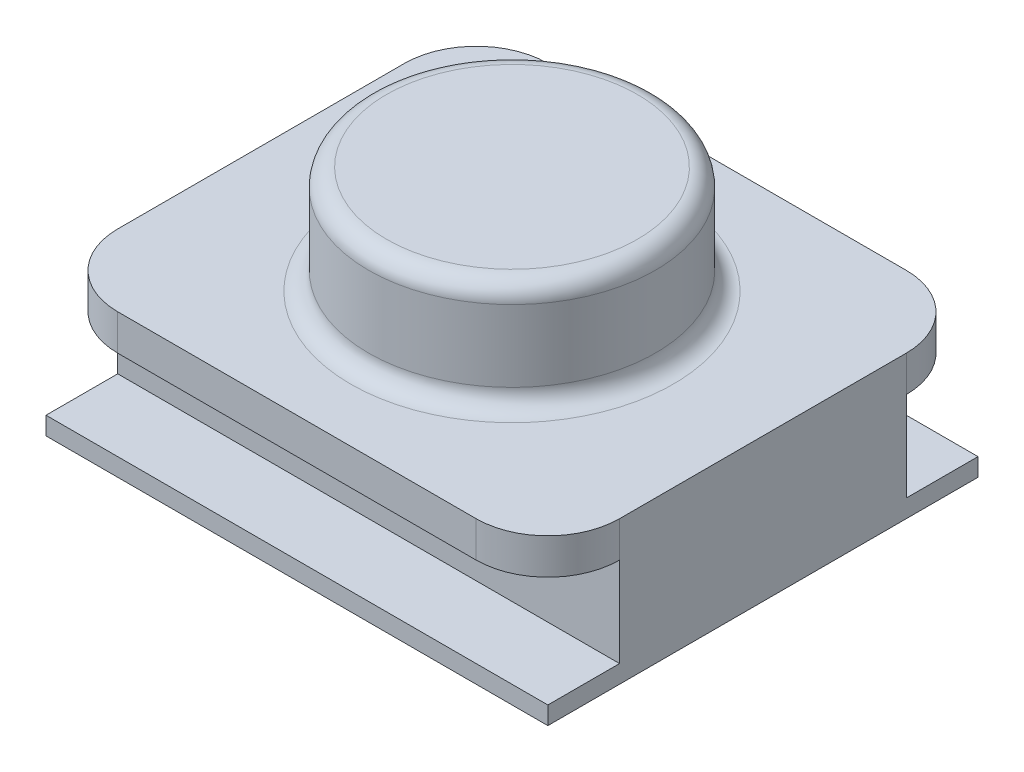
ISO-10303-21;
HEADER;
FILE_DESCRIPTION(('STEP AP214'),'2;1');
FILE_NAME('part.step','',(''),(''),'','','');
FILE_SCHEMA(('AUTOMOTIVE_DESIGN { 1 0 10303 214 1 1 1 1 }'));
ENDSEC;
DATA;
#1=APPLICATION_CONTEXT('core data for automotive mechanical design processes');
#2=APPLICATION_PROTOCOL_DEFINITION('international standard','automotive_design',2000,#1);
#3=PRODUCT_CONTEXT('',#1,'mechanical');
#4=PRODUCT('Part','Part','',(#3));
#5=PRODUCT_RELATED_PRODUCT_CATEGORY('part','',(#4));
#6=PRODUCT_DEFINITION_FORMATION('','',#4);
#7=PRODUCT_DEFINITION_CONTEXT('part definition',#1,'design');
#8=PRODUCT_DEFINITION('design','',#6,#7);
#9=PRODUCT_DEFINITION_SHAPE('','',#8);
#10=(LENGTH_UNIT() NAMED_UNIT(*) SI_UNIT(.MILLI.,.METRE.));
#11=(NAMED_UNIT(*) PLANE_ANGLE_UNIT() SI_UNIT($,.RADIAN.));
#12=(NAMED_UNIT(*) SI_UNIT($,.STERADIAN.) SOLID_ANGLE_UNIT());
#13=UNCERTAINTY_MEASURE_WITH_UNIT(LENGTH_MEASURE(1.E-05),#10,'distance_accuracy_value','');
#14=(GEOMETRIC_REPRESENTATION_CONTEXT(3) GLOBAL_UNCERTAINTY_ASSIGNED_CONTEXT((#13)) GLOBAL_UNIT_ASSIGNED_CONTEXT((#10,
#11,#12)) REPRESENTATION_CONTEXT('',''));
#15=CARTESIAN_POINT('',(0.,0.,0.));
#16=DIRECTION('',(0.,0.,1.));
#17=DIRECTION('',(1.,0.,0.));
#18=AXIS2_PLACEMENT_3D('',#15,#16,#17);
#19=CARTESIAN_POINT('',(0.,0.25,0.));
#20=DIRECTION('',(0.,-1.,0.));
#21=DIRECTION('',(0.,0.,-1.));
#22=AXIS2_PLACEMENT_3D('',#19,#20,#21);
#23=PLANE('',#22);
#24=DIRECTION('',(1.,0.,0.));
#25=VECTOR('',#24,1.);
#26=CARTESIAN_POINT('',(-3.5,0.25,2.));
#27=LINE('',#26,#25);
#28=CARTESIAN_POINT('',(-3.5,0.25,2.));
#29=VERTEX_POINT('',#28);
#30=CARTESIAN_POINT('',(3.5,0.25,2.));
#31=VERTEX_POINT('',#30);
#32=EDGE_CURVE('E275',#29,#31,#27,.T.);
#33=ORIENTED_EDGE('',*,*,#32,.F.);
#34=DIRECTION('',(0.,0.,1.));
#35=VECTOR('',#34,1.);
#36=CARTESIAN_POINT('',(-3.5,0.25,3.));
#37=LINE('',#36,#35);
#38=CARTESIAN_POINT('',(-3.5,0.25,3.));
#39=VERTEX_POINT('',#38);
#40=EDGE_CURVE('E300',#29,#39,#37,.T.);
#41=ORIENTED_EDGE('',*,*,#40,.T.);
#42=DIRECTION('',(1.,0.,0.));
#43=VECTOR('',#42,1.);
#44=CARTESIAN_POINT('',(-3.5,0.25,3.));
#45=LINE('',#44,#43);
#46=CARTESIAN_POINT('',(3.5,0.25,3.));
#47=VERTEX_POINT('',#46);
#48=EDGE_CURVE('E303',#39,#47,#45,.T.);
#49=ORIENTED_EDGE('',*,*,#48,.T.);
#50=DIRECTION('',(0.,0.,-1.));
#51=VECTOR('',#50,1.);
#52=CARTESIAN_POINT('',(3.5,0.25,3.));
#53=LINE('',#52,#51);
#54=EDGE_CURVE('E295',#47,#31,#53,.T.);
#55=ORIENTED_EDGE('',*,*,#54,.T.);
#56=EDGE_LOOP('',(#33,#41,#49,#55));
#57=FACE_BOUND('',#56,.T.);
#58=ADVANCED_FACE('F35',(#57),#23,.F.);
#59=DIRECTION('',(-1.,0.,0.));
#60=VECTOR('',#59,1.);
#61=CARTESIAN_POINT('',(-3.5,0.25,-2.));
#62=LINE('',#61,#60);
#63=CARTESIAN_POINT('',(3.5,0.25,-2.));
#64=VERTEX_POINT('',#63);
#65=CARTESIAN_POINT('',(-3.5,0.25,-2.));
#66=VERTEX_POINT('',#65);
#67=EDGE_CURVE('E266',#64,#66,#62,.T.);
#68=ORIENTED_EDGE('',*,*,#67,.F.);
#69=CARTESIAN_POINT('',(3.5,0.25,-3.));
#70=VERTEX_POINT('',#69);
#71=EDGE_CURVE('E298',#64,#70,#53,.T.);
#72=ORIENTED_EDGE('',*,*,#71,.T.);
#73=DIRECTION('',(-1.,0.,0.));
#74=VECTOR('',#73,1.);
#75=CARTESIAN_POINT('',(-3.5,0.25,-3.));
#76=LINE('',#75,#74);
#77=CARTESIAN_POINT('',(-3.5,0.25,-3.));
#78=VERTEX_POINT('',#77);
#79=EDGE_CURVE('E297',#70,#78,#76,.T.);
#80=ORIENTED_EDGE('',*,*,#79,.T.);
#81=EDGE_CURVE('E301',#78,#66,#37,.T.);
#82=ORIENTED_EDGE('',*,*,#81,.T.);
#83=EDGE_LOOP('',(#68,#72,#80,#82));
#84=FACE_BOUND('',#83,.T.);
#85=ADVANCED_FACE('F447',(#84),#23,.F.);
#86=CARTESIAN_POINT('',(3.5,0.25,3.));
#87=DIRECTION('',(-1.,0.,0.));
#88=DIRECTION('',(0.,0.,1.));
#89=AXIS2_PLACEMENT_3D('',#86,#87,#88);
#90=PLANE('',#89);
#91=DIRECTION('',(0.,-1.,0.));
#92=VECTOR('',#91,1.);
#93=CARTESIAN_POINT('',(3.5,1.5,-2.));
#94=LINE('',#93,#92);
#95=CARTESIAN_POINT('',(3.5,1.5,-2.));
#96=VERTEX_POINT('',#95);
#97=EDGE_CURVE('E291',#96,#64,#94,.T.);
#98=ORIENTED_EDGE('',*,*,#97,.F.);
#99=DIRECTION('',(0.,-1.,0.));
#100=VECTOR('',#99,1.);
#101=CARTESIAN_POINT('',(3.5,0.25,-2.));
#102=LINE('',#101,#100);
#103=CARTESIAN_POINT('',(3.5,2.,-2.));
#104=VERTEX_POINT('',#103);
#105=EDGE_CURVE('E362',#96,#104,#102,.F.);
#106=ORIENTED_EDGE('',*,*,#105,.T.);
#107=DIRECTION('',(0.,0.,-1.));
#108=VECTOR('',#107,1.);
#109=CARTESIAN_POINT('',(3.5,2.,-3.));
#110=LINE('',#109,#108);
#111=CARTESIAN_POINT('',(3.5,2.,2.));
#112=VERTEX_POINT('',#111);
#113=EDGE_CURVE('E253',#112,#104,#110,.T.);
#114=ORIENTED_EDGE('',*,*,#113,.F.);
#115=DIRECTION('',(0.,-1.,0.));
#116=VECTOR('',#115,1.);
#117=CARTESIAN_POINT('',(3.5,0.25,2.));
#118=LINE('',#117,#116);
#119=CARTESIAN_POINT('',(3.5,1.5,2.));
#120=VERTEX_POINT('',#119);
#121=EDGE_CURVE('E359',#112,#120,#118,.T.);
#122=ORIENTED_EDGE('',*,*,#121,.T.);
#123=DIRECTION('',(0.,-1.,0.));
#124=VECTOR('',#123,1.);
#125=CARTESIAN_POINT('',(3.5,1.5,2.));
#126=LINE('',#125,#124);
#127=EDGE_CURVE('E278',#120,#31,#126,.T.);
#128=ORIENTED_EDGE('',*,*,#127,.T.);
#129=ORIENTED_EDGE('',*,*,#54,.F.);
#130=DIRECTION('',(0.,-1.,0.));
#131=VECTOR('',#130,1.);
#132=CARTESIAN_POINT('',(3.5,0.25,3.));
#133=LINE('',#132,#131);
#134=CARTESIAN_POINT('',(3.5,0.,3.));
#135=VERTEX_POINT('',#134);
#136=EDGE_CURVE('E305',#47,#135,#133,.T.);
#137=ORIENTED_EDGE('',*,*,#136,.T.);
#138=DIRECTION('',(0.,0.,-1.));
#139=VECTOR('',#138,1.);
#140=CARTESIAN_POINT('',(3.5,0.,3.));
#141=LINE('',#140,#139);
#142=CARTESIAN_POINT('',(3.5,0.,-3.));
#143=VERTEX_POINT('',#142);
#144=EDGE_CURVE('E294',#135,#143,#141,.T.);
#145=ORIENTED_EDGE('',*,*,#144,.T.);
#146=DIRECTION('',(0.,-1.,0.));
#147=VECTOR('',#146,1.);
#148=CARTESIAN_POINT('',(3.5,0.25,-3.));
#149=LINE('',#148,#147);
#150=EDGE_CURVE('E322',#70,#143,#149,.T.);
#151=ORIENTED_EDGE('',*,*,#150,.F.);
#152=ORIENTED_EDGE('',*,*,#71,.F.);
#153=EDGE_LOOP('',(#98,#106,#114,#122,#128,#129,#137,#145,#151,#152));
#154=FACE_BOUND('',#153,.T.);
#155=ADVANCED_FACE('F388',(#154),#90,.F.);
#156=CARTESIAN_POINT('',(-3.5,0.25,-3.));
#157=DIRECTION('',(0.,0.,1.));
#158=DIRECTION('',(1.,0.,0.));
#159=AXIS2_PLACEMENT_3D('',#156,#157,#158);
#160=PLANE('',#159);
#161=DIRECTION('',(-1.,0.,0.));
#162=VECTOR('',#161,1.);
#163=CARTESIAN_POINT('',(-3.5,0.,-3.));
#164=LINE('',#163,#162);
#165=CARTESIAN_POINT('',(-3.5,0.,-3.));
#166=VERTEX_POINT('',#165);
#167=EDGE_CURVE('E308',#143,#166,#164,.T.);
#168=ORIENTED_EDGE('',*,*,#167,.T.);
#169=DIRECTION('',(0.,-1.,0.));
#170=VECTOR('',#169,1.);
#171=CARTESIAN_POINT('',(-3.5,0.25,-3.));
#172=LINE('',#171,#170);
#173=EDGE_CURVE('E319',#78,#166,#172,.T.);
#174=ORIENTED_EDGE('',*,*,#173,.F.);
#175=ORIENTED_EDGE('',*,*,#79,.F.);
#176=ORIENTED_EDGE('',*,*,#150,.T.);
#177=EDGE_LOOP('',(#168,#174,#175,#176));
#178=FACE_BOUND('',#177,.T.);
#179=ADVANCED_FACE('F412',(#178),#160,.F.);
#180=CARTESIAN_POINT('',(-3.5,0.25,3.));
#181=DIRECTION('',(1.,0.,0.));
#182=DIRECTION('',(0.,0.,-1.));
#183=AXIS2_PLACEMENT_3D('',#180,#181,#182);
#184=PLANE('',#183);
#185=DIRECTION('',(0.,0.,1.));
#186=VECTOR('',#185,1.);
#187=CARTESIAN_POINT('',(-3.5,2.,-3.));
#188=LINE('',#187,#186);
#189=CARTESIAN_POINT('',(-3.5,2.,-2.));
#190=VERTEX_POINT('',#189);
#191=CARTESIAN_POINT('',(-3.5,2.,2.));
#192=VERTEX_POINT('',#191);
#193=EDGE_CURVE('E260',#190,#192,#188,.T.);
#194=ORIENTED_EDGE('',*,*,#193,.F.);
#195=DIRECTION('',(0.,-1.,0.));
#196=VECTOR('',#195,1.);
#197=CARTESIAN_POINT('',(-3.5,0.25,-2.));
#198=LINE('',#197,#196);
#199=CARTESIAN_POINT('',(-3.5,1.5,-2.));
#200=VERTEX_POINT('',#199);
#201=EDGE_CURVE('E339',#190,#200,#198,.T.);
#202=ORIENTED_EDGE('',*,*,#201,.T.);
#203=DIRECTION('',(0.,-1.,0.));
#204=VECTOR('',#203,1.);
#205=CARTESIAN_POINT('',(-3.5,1.5,-2.));
#206=LINE('',#205,#204);
#207=EDGE_CURVE('E288',#200,#66,#206,.T.);
#208=ORIENTED_EDGE('',*,*,#207,.T.);
#209=ORIENTED_EDGE('',*,*,#81,.F.);
#210=ORIENTED_EDGE('',*,*,#173,.T.);
#211=DIRECTION('',(0.,0.,1.));
#212=VECTOR('',#211,1.);
#213=CARTESIAN_POINT('',(-3.5,0.,3.));
#214=LINE('',#213,#212);
#215=CARTESIAN_POINT('',(-3.5,0.,3.));
#216=VERTEX_POINT('',#215);
#217=EDGE_CURVE('E310',#166,#216,#214,.T.);
#218=ORIENTED_EDGE('',*,*,#217,.T.);
#219=DIRECTION('',(0.,-1.,0.));
#220=VECTOR('',#219,1.);
#221=CARTESIAN_POINT('',(-3.5,0.25,3.));
#222=LINE('',#221,#220);
#223=EDGE_CURVE('E316',#39,#216,#222,.T.);
#224=ORIENTED_EDGE('',*,*,#223,.F.);
#225=ORIENTED_EDGE('',*,*,#40,.F.);
#226=DIRECTION('',(0.,-1.,0.));
#227=VECTOR('',#226,1.);
#228=CARTESIAN_POINT('',(-3.5,1.5,2.));
#229=LINE('',#228,#227);
#230=CARTESIAN_POINT('',(-3.5,1.5,2.));
#231=VERTEX_POINT('',#230);
#232=EDGE_CURVE('E285',#231,#29,#229,.T.);
#233=ORIENTED_EDGE('',*,*,#232,.F.);
#234=DIRECTION('',(0.,-1.,0.));
#235=VECTOR('',#234,1.);
#236=CARTESIAN_POINT('',(-3.5,0.25,2.));
#237=LINE('',#236,#235);
#238=EDGE_CURVE('E337',#231,#192,#237,.F.);
#239=ORIENTED_EDGE('',*,*,#238,.T.);
#240=EDGE_LOOP('',(#194,#202,#208,#209,#210,#218,#224,#225,#233,#239));
#241=FACE_BOUND('',#240,.T.);
#242=ADVANCED_FACE('F398',(#241),#184,.F.);
#243=CARTESIAN_POINT('',(-3.5,0.25,3.));
#244=DIRECTION('',(0.,0.,-1.));
#245=DIRECTION('',(-1.,0.,0.));
#246=AXIS2_PLACEMENT_3D('',#243,#244,#245);
#247=PLANE('',#246);
#248=DIRECTION('',(1.,0.,0.));
#249=VECTOR('',#248,1.);
#250=CARTESIAN_POINT('',(-3.5,0.,3.));
#251=LINE('',#250,#249);
#252=EDGE_CURVE('E312',#216,#135,#251,.T.);
#253=ORIENTED_EDGE('',*,*,#252,.T.);
#254=ORIENTED_EDGE('',*,*,#136,.F.);
#255=ORIENTED_EDGE('',*,*,#48,.F.);
#256=ORIENTED_EDGE('',*,*,#223,.T.);
#257=EDGE_LOOP('',(#253,#254,#255,#256));
#258=FACE_BOUND('',#257,.T.);
#259=ADVANCED_FACE('F404',(#258),#247,.F.);
#260=CARTESIAN_POINT('',(0.,0.,0.));
#261=DIRECTION('',(0.,-1.,0.));
#262=DIRECTION('',(0.,0.,-1.));
#263=AXIS2_PLACEMENT_3D('',#260,#261,#262);
#264=PLANE('',#263);
#265=DIRECTION('',(0.,0.,1.));
#266=VECTOR('',#265,1.);
#267=CARTESIAN_POINT('',(2.,0.,0.5));
#268=LINE('',#267,#266);
#269=CARTESIAN_POINT('',(2.,0.,-0.5));
#270=VERTEX_POINT('',#269);
#271=CARTESIAN_POINT('',(2.,0.,0.5));
#272=VERTEX_POINT('',#271);
#273=EDGE_CURVE('E216',#270,#272,#268,.T.);
#274=ORIENTED_EDGE('',*,*,#273,.F.);
#275=DIRECTION('',(1.,0.,0.));
#276=VECTOR('',#275,1.);
#277=CARTESIAN_POINT('',(-2.,0.,-0.5));
#278=LINE('',#277,#276);
#279=CARTESIAN_POINT('',(-2.,0.,-0.5));
#280=VERTEX_POINT('',#279);
#281=EDGE_CURVE('E224',#280,#270,#278,.T.);
#282=ORIENTED_EDGE('',*,*,#281,.F.);
#283=DIRECTION('',(0.,0.,-1.));
#284=VECTOR('',#283,1.);
#285=CARTESIAN_POINT('',(-2.,0.,0.5));
#286=LINE('',#285,#284);
#287=CARTESIAN_POINT('',(-2.,0.,0.5));
#288=VERTEX_POINT('',#287);
#289=EDGE_CURVE('E236',#288,#280,#286,.T.);
#290=ORIENTED_EDGE('',*,*,#289,.F.);
#291=DIRECTION('',(-1.,0.,0.));
#292=VECTOR('',#291,1.);
#293=CARTESIAN_POINT('',(-2.,0.,0.5));
#294=LINE('',#293,#292);
#295=EDGE_CURVE('E233',#272,#288,#294,.T.);
#296=ORIENTED_EDGE('',*,*,#295,.F.);
#297=EDGE_LOOP('',(#274,#282,#290,#296));
#298=FACE_BOUND('',#297,.T.);
#299=ORIENTED_EDGE('',*,*,#144,.F.);
#300=ORIENTED_EDGE('',*,*,#252,.F.);
#301=ORIENTED_EDGE('',*,*,#217,.F.);
#302=ORIENTED_EDGE('',*,*,#167,.F.);
#303=EDGE_LOOP('',(#299,#300,#301,#302));
#304=FACE_BOUND('',#303,.T.);
#305=ADVANCED_FACE('F408',(#298,#304),#264,.T.);
#306=CARTESIAN_POINT('',(-3.5,1.5,-2.));
#307=DIRECTION('',(0.,0.,1.));
#308=DIRECTION('',(1.,0.,0.));
#309=AXIS2_PLACEMENT_3D('',#306,#307,#308);
#310=PLANE('',#309);
#311=ORIENTED_EDGE('',*,*,#67,.T.);
#312=ORIENTED_EDGE('',*,*,#207,.F.);
#313=DIRECTION('',(-1.,0.,0.));
#314=VECTOR('',#313,1.);
#315=CARTESIAN_POINT('',(-3.5,1.5,-2.));
#316=LINE('',#315,#314);
#317=EDGE_CURVE('E271',#96,#200,#316,.T.);
#318=ORIENTED_EDGE('',*,*,#317,.F.);
#319=ORIENTED_EDGE('',*,*,#97,.T.);
#320=EDGE_LOOP('',(#311,#312,#318,#319));
#321=FACE_BOUND('',#320,.T.);
#322=ADVANCED_FACE('F418',(#321),#310,.F.);
#323=CARTESIAN_POINT('',(-3.5,1.5,2.));
#324=DIRECTION('',(0.,0.,-1.));
#325=DIRECTION('',(-1.,0.,0.));
#326=AXIS2_PLACEMENT_3D('',#323,#324,#325);
#327=PLANE('',#326);
#328=ORIENTED_EDGE('',*,*,#32,.T.);
#329=ORIENTED_EDGE('',*,*,#127,.F.);
#330=DIRECTION('',(1.,0.,0.));
#331=VECTOR('',#330,1.);
#332=CARTESIAN_POINT('',(-3.5,1.5,2.));
#333=LINE('',#332,#331);
#334=EDGE_CURVE('E274',#231,#120,#333,.T.);
#335=ORIENTED_EDGE('',*,*,#334,.F.);
#336=ORIENTED_EDGE('',*,*,#232,.T.);
#337=EDGE_LOOP('',(#328,#329,#335,#336));
#338=FACE_BOUND('',#337,.T.);
#339=ADVANCED_FACE('F391',(#338),#327,.F.);
#340=CARTESIAN_POINT('',(0.,1.5,0.));
#341=DIRECTION('',(0.,1.,0.));
#342=DIRECTION('',(0.,0.,1.));
#343=AXIS2_PLACEMENT_3D('',#340,#341,#342);
#344=PLANE('',#343);
#345=ORIENTED_EDGE('',*,*,#317,.T.);
#346=CARTESIAN_POINT('',(-2.5,1.5,-2.));
#347=DIRECTION('',(0.,1.,0.));
#348=DIRECTION('',(0.,0.,1.));
#349=AXIS2_PLACEMENT_3D('',#346,#347,#348);
#350=CIRCLE('',#349,1.);
#351=CARTESIAN_POINT('',(-2.5,1.5,-3.));
#352=VERTEX_POINT('',#351);
#353=EDGE_CURVE('E344',#200,#352,#350,.F.);
#354=ORIENTED_EDGE('',*,*,#353,.T.);
#355=DIRECTION('',(-1.,0.,0.));
#356=VECTOR('',#355,1.);
#357=CARTESIAN_POINT('',(-3.5,1.5,-3.));
#358=LINE('',#357,#356);
#359=CARTESIAN_POINT('',(2.5,1.5,-3.));
#360=VERTEX_POINT('',#359);
#361=EDGE_CURVE('E252',#360,#352,#358,.T.);
#362=ORIENTED_EDGE('',*,*,#361,.F.);
#363=CARTESIAN_POINT('',(2.5,1.5,-2.));
#364=DIRECTION('',(0.,1.,0.));
#365=DIRECTION('',(0.,0.,1.));
#366=AXIS2_PLACEMENT_3D('',#363,#364,#365);
#367=CIRCLE('',#366,1.);
#368=EDGE_CURVE('E342',#360,#96,#367,.F.);
#369=ORIENTED_EDGE('',*,*,#368,.T.);
#370=EDGE_LOOP('',(#345,#354,#362,#369));
#371=FACE_BOUND('',#370,.T.);
#372=ADVANCED_FACE('F421',(#371),#344,.F.);
#373=ORIENTED_EDGE('',*,*,#334,.T.);
#374=CARTESIAN_POINT('',(2.5,1.5,2.));
#375=DIRECTION('',(0.,1.,0.));
#376=DIRECTION('',(0.,0.,1.));
#377=AXIS2_PLACEMENT_3D('',#374,#375,#376);
#378=CIRCLE('',#377,1.);
#379=CARTESIAN_POINT('',(2.5,1.5,3.));
#380=VERTEX_POINT('',#379);
#381=EDGE_CURVE('E366',#120,#380,#378,.F.);
#382=ORIENTED_EDGE('',*,*,#381,.T.);
#383=DIRECTION('',(1.,0.,0.));
#384=VECTOR('',#383,1.);
#385=CARTESIAN_POINT('',(-3.5,1.5,3.));
#386=LINE('',#385,#384);
#387=CARTESIAN_POINT('',(-2.5,1.5,3.));
#388=VERTEX_POINT('',#387);
#389=EDGE_CURVE('E257',#388,#380,#386,.T.);
#390=ORIENTED_EDGE('',*,*,#389,.F.);
#391=CARTESIAN_POINT('',(-2.5,1.5,2.));
#392=DIRECTION('',(0.,1.,0.));
#393=DIRECTION('',(0.,0.,1.));
#394=AXIS2_PLACEMENT_3D('',#391,#392,#393);
#395=CIRCLE('',#394,1.);
#396=EDGE_CURVE('E364',#388,#231,#395,.F.);
#397=ORIENTED_EDGE('',*,*,#396,.T.);
#398=EDGE_LOOP('',(#373,#382,#390,#397));
#399=FACE_BOUND('',#398,.T.);
#400=ADVANCED_FACE('F377',(#399),#344,.F.);
#401=CARTESIAN_POINT('',(-3.5,2.,-3.));
#402=DIRECTION('',(0.,0.,1.));
#403=DIRECTION('',(1.,0.,0.));
#404=AXIS2_PLACEMENT_3D('',#401,#402,#403);
#405=PLANE('',#404);
#406=ORIENTED_EDGE('',*,*,#361,.T.);
#407=DIRECTION('',(0.,-1.,0.));
#408=VECTOR('',#407,1.);
#409=CARTESIAN_POINT('',(-2.5,2.,-3.));
#410=LINE('',#409,#408);
#411=CARTESIAN_POINT('',(-2.5,2.,-3.));
#412=VERTEX_POINT('',#411);
#413=EDGE_CURVE('E349',#352,#412,#410,.F.);
#414=ORIENTED_EDGE('',*,*,#413,.T.);
#415=DIRECTION('',(-1.,0.,0.));
#416=VECTOR('',#415,1.);
#417=CARTESIAN_POINT('',(-3.5,2.,-3.));
#418=LINE('',#417,#416);
#419=CARTESIAN_POINT('',(2.5,2.,-3.));
#420=VERTEX_POINT('',#419);
#421=EDGE_CURVE('E256',#420,#412,#418,.T.);
#422=ORIENTED_EDGE('',*,*,#421,.F.);
#423=DIRECTION('',(0.,-1.,0.));
#424=VECTOR('',#423,1.);
#425=CARTESIAN_POINT('',(2.5,2.,-3.));
#426=LINE('',#425,#424);
#427=EDGE_CURVE('E346',#420,#360,#426,.T.);
#428=ORIENTED_EDGE('',*,*,#427,.T.);
#429=EDGE_LOOP('',(#406,#414,#422,#428));
#430=FACE_BOUND('',#429,.T.);
#431=ADVANCED_FACE('F429',(#430),#405,.F.);
#432=CARTESIAN_POINT('',(-3.5,2.,3.));
#433=DIRECTION('',(0.,0.,-1.));
#434=DIRECTION('',(-1.,0.,0.));
#435=AXIS2_PLACEMENT_3D('',#432,#433,#434);
#436=PLANE('',#435);
#437=ORIENTED_EDGE('',*,*,#389,.T.);
#438=DIRECTION('',(0.,-1.,0.));
#439=VECTOR('',#438,1.);
#440=CARTESIAN_POINT('',(2.5,2.,3.));
#441=LINE('',#440,#439);
#442=CARTESIAN_POINT('',(2.5,2.,3.));
#443=VERTEX_POINT('',#442);
#444=EDGE_CURVE('E11',#380,#443,#441,.F.);
#445=ORIENTED_EDGE('',*,*,#444,.T.);
#446=DIRECTION('',(1.,0.,0.));
#447=VECTOR('',#446,1.);
#448=CARTESIAN_POINT('',(-3.5,2.,3.));
#449=LINE('',#448,#447);
#450=CARTESIAN_POINT('',(-2.5,2.,3.));
#451=VERTEX_POINT('',#450);
#452=EDGE_CURVE('E263',#451,#443,#449,.T.);
#453=ORIENTED_EDGE('',*,*,#452,.F.);
#454=DIRECTION('',(0.,-1.,0.));
#455=VECTOR('',#454,1.);
#456=CARTESIAN_POINT('',(-2.5,2.,3.));
#457=LINE('',#456,#455);
#458=EDGE_CURVE('E43',#451,#388,#457,.T.);
#459=ORIENTED_EDGE('',*,*,#458,.T.);
#460=EDGE_LOOP('',(#437,#445,#453,#459));
#461=FACE_BOUND('',#460,.T.);
#462=ADVANCED_FACE('F372',(#461),#436,.F.);
#463=CARTESIAN_POINT('',(0.,2.,0.));
#464=DIRECTION('',(0.,1.,0.));
#465=DIRECTION('',(0.,0.,1.));
#466=AXIS2_PLACEMENT_3D('',#463,#464,#465);
#467=PLANE('',#466);
#468=CARTESIAN_POINT('',(0.,2.,0.));
#469=DIRECTION('',(0.,1.,0.));
#470=DIRECTION('',(0.,0.,1.));
#471=AXIS2_PLACEMENT_3D('',#468,#469,#470);
#472=CIRCLE('',#471,2.25);
#473=CARTESIAN_POINT('',(0.,2.,2.25));
#474=VERTEX_POINT('',#473);
#475=EDGE_CURVE('E331',#474,#474,#472,.F.);
#476=ORIENTED_EDGE('',*,*,#475,.T.);
#477=EDGE_LOOP('',(#476));
#478=FACE_BOUND('',#477,.T.);
#479=ORIENTED_EDGE('',*,*,#421,.T.);
#480=CARTESIAN_POINT('',(-2.5,2.,-2.));
#481=DIRECTION('',(0.,1.,0.));
#482=DIRECTION('',(0.,0.,1.));
#483=AXIS2_PLACEMENT_3D('',#480,#481,#482);
#484=CIRCLE('',#483,1.);
#485=EDGE_CURVE('E357',#412,#190,#484,.T.);
#486=ORIENTED_EDGE('',*,*,#485,.T.);
#487=ORIENTED_EDGE('',*,*,#193,.T.);
#488=CARTESIAN_POINT('',(-2.5,2.,2.));
#489=DIRECTION('',(0.,1.,0.));
#490=DIRECTION('',(0.,0.,1.));
#491=AXIS2_PLACEMENT_3D('',#488,#489,#490);
#492=CIRCLE('',#491,1.);
#493=EDGE_CURVE('E351',#192,#451,#492,.T.);
#494=ORIENTED_EDGE('',*,*,#493,.T.);
#495=ORIENTED_EDGE('',*,*,#452,.T.);
#496=CARTESIAN_POINT('',(2.5,2.,2.));
#497=DIRECTION('',(0.,1.,0.));
#498=DIRECTION('',(0.,0.,1.));
#499=AXIS2_PLACEMENT_3D('',#496,#497,#498);
#500=CIRCLE('',#499,1.);
#501=EDGE_CURVE('E353',#443,#112,#500,.T.);
#502=ORIENTED_EDGE('',*,*,#501,.T.);
#503=ORIENTED_EDGE('',*,*,#113,.T.);
#504=CARTESIAN_POINT('',(2.5,2.,-2.));
#505=DIRECTION('',(0.,1.,0.));
#506=DIRECTION('',(0.,0.,1.));
#507=AXIS2_PLACEMENT_3D('',#504,#505,#506);
#508=CIRCLE('',#507,1.);
#509=EDGE_CURVE('E355',#104,#420,#508,.T.);
#510=ORIENTED_EDGE('',*,*,#509,.T.);
#511=EDGE_LOOP('',(#479,#486,#487,#494,#495,#502,#503,#510));
#512=FACE_BOUND('',#511,.T.);
#513=ADVANCED_FACE('F433',(#478,#512),#467,.T.);
#514=CARTESIAN_POINT('',(0.,3.5,0.));
#515=DIRECTION('',(0.,-1.,0.));
#516=DIRECTION('',(0.,0.,-1.));
#517=AXIS2_PLACEMENT_3D('',#514,#515,#516);
#518=CYLINDRICAL_SURFACE('',#517,2.);
#519=CARTESIAN_POINT('',(0.,2.25,0.));
#520=DIRECTION('',(0.,1.,0.));
#521=DIRECTION('',(0.,0.,1.));
#522=AXIS2_PLACEMENT_3D('',#519,#520,#521);
#523=CIRCLE('',#522,2.);
#524=CARTESIAN_POINT('',(0.,2.25,2.));
#525=VERTEX_POINT('',#524);
#526=EDGE_CURVE('E328',#525,#525,#523,.T.);
#527=ORIENTED_EDGE('',*,*,#526,.T.);
#528=EDGE_LOOP('',(#527));
#529=FACE_BOUND('',#528,.T.);
#530=CARTESIAN_POINT('',(0.,3.25,0.));
#531=DIRECTION('',(0.,1.,0.));
#532=DIRECTION('',(0.,0.,1.));
#533=AXIS2_PLACEMENT_3D('',#530,#531,#532);
#534=CIRCLE('',#533,2.);
#535=CARTESIAN_POINT('',(0.,3.25,2.));
#536=VERTEX_POINT('',#535);
#537=EDGE_CURVE('E325',#536,#536,#534,.F.);
#538=ORIENTED_EDGE('',*,*,#537,.T.);
#539=EDGE_LOOP('',(#538));
#540=FACE_BOUND('',#539,.T.);
#541=ADVANCED_FACE('F585',(#529,#540),#518,.T.);
#542=CARTESIAN_POINT('',(0.,3.5,0.));
#543=DIRECTION('',(0.,1.,0.));
#544=DIRECTION('',(0.,0.,1.));
#545=AXIS2_PLACEMENT_3D('',#542,#543,#544);
#546=PLANE('',#545);
#547=CARTESIAN_POINT('',(0.,3.5,0.));
#548=DIRECTION('',(0.,1.,0.));
#549=DIRECTION('',(0.,0.,1.));
#550=AXIS2_PLACEMENT_3D('',#547,#548,#549);
#551=CIRCLE('',#550,1.75);
#552=CARTESIAN_POINT('',(0.,3.5,1.75));
#553=VERTEX_POINT('',#552);
#554=EDGE_CURVE('E334',#553,#553,#551,.T.);
#555=ORIENTED_EDGE('',*,*,#554,.T.);
#556=EDGE_LOOP('',(#555));
#557=FACE_BOUND('',#556,.T.);
#558=ADVANCED_FACE('F470',(#557),#546,.T.);
#559=CARTESIAN_POINT('',(0.,2.25,0.));
#560=DIRECTION('',(0.,1.,0.));
#561=DIRECTION('',(0.,0.,1.));
#562=AXIS2_PLACEMENT_3D('',#559,#560,#561);
#563=TOROIDAL_SURFACE('',#562,2.25,0.25);
#564=ORIENTED_EDGE('',*,*,#475,.F.);
#565=EDGE_LOOP('',(#564));
#566=FACE_BOUND('',#565,.T.);
#567=ORIENTED_EDGE('',*,*,#526,.F.);
#568=EDGE_LOOP('',(#567));
#569=FACE_BOUND('',#568,.T.);
#570=ADVANCED_FACE('F466',(#566,#569),#563,.F.);
#571=CARTESIAN_POINT('',(0.,3.25,0.));
#572=DIRECTION('',(0.,1.,0.));
#573=DIRECTION('',(0.,0.,1.));
#574=AXIS2_PLACEMENT_3D('',#571,#572,#573);
#575=TOROIDAL_SURFACE('',#574,1.75,0.25);
#576=ORIENTED_EDGE('',*,*,#537,.F.);
#577=EDGE_LOOP('',(#576));
#578=FACE_BOUND('',#577,.T.);
#579=ORIENTED_EDGE('',*,*,#554,.F.);
#580=EDGE_LOOP('',(#579));
#581=FACE_BOUND('',#580,.T.);
#582=ADVANCED_FACE('F469',(#578,#581),#575,.T.);
#583=CARTESIAN_POINT('',(-2.5,0.25,-2.));
#584=DIRECTION('',(0.,-1.,0.));
#585=DIRECTION('',(0.,0.,-1.));
#586=AXIS2_PLACEMENT_3D('',#583,#584,#585);
#587=CYLINDRICAL_SURFACE('',#586,1.);
#588=ORIENTED_EDGE('',*,*,#485,.F.);
#589=ORIENTED_EDGE('',*,*,#413,.F.);
#590=ORIENTED_EDGE('',*,*,#353,.F.);
#591=ORIENTED_EDGE('',*,*,#201,.F.);
#592=EDGE_LOOP('',(#588,#589,#590,#591));
#593=FACE_BOUND('',#592,.T.);
#594=ADVANCED_FACE('F436',(#593),#587,.T.);
#595=CARTESIAN_POINT('',(2.5,2.,-2.));
#596=DIRECTION('',(0.,-1.,0.));
#597=DIRECTION('',(0.,0.,-1.));
#598=AXIS2_PLACEMENT_3D('',#595,#596,#597);
#599=CYLINDRICAL_SURFACE('',#598,1.);
#600=ORIENTED_EDGE('',*,*,#509,.F.);
#601=ORIENTED_EDGE('',*,*,#105,.F.);
#602=ORIENTED_EDGE('',*,*,#368,.F.);
#603=ORIENTED_EDGE('',*,*,#427,.F.);
#604=EDGE_LOOP('',(#600,#601,#602,#603));
#605=FACE_BOUND('',#604,.T.);
#606=ADVANCED_FACE('F426',(#605),#599,.T.);
#607=CARTESIAN_POINT('',(2.5,0.25,2.));
#608=DIRECTION('',(0.,-1.,0.));
#609=DIRECTION('',(0.,0.,-1.));
#610=AXIS2_PLACEMENT_3D('',#607,#608,#609);
#611=CYLINDRICAL_SURFACE('',#610,1.);
#612=ORIENTED_EDGE('',*,*,#501,.F.);
#613=ORIENTED_EDGE('',*,*,#444,.F.);
#614=ORIENTED_EDGE('',*,*,#381,.F.);
#615=ORIENTED_EDGE('',*,*,#121,.F.);
#616=EDGE_LOOP('',(#612,#613,#614,#615));
#617=FACE_BOUND('',#616,.T.);
#618=ADVANCED_FACE('F383',(#617),#611,.T.);
#619=CARTESIAN_POINT('',(-2.5,2.,2.));
#620=DIRECTION('',(0.,-1.,0.));
#621=DIRECTION('',(0.,0.,-1.));
#622=AXIS2_PLACEMENT_3D('',#619,#620,#621);
#623=CYLINDRICAL_SURFACE('',#622,1.);
#624=ORIENTED_EDGE('',*,*,#493,.F.);
#625=ORIENTED_EDGE('',*,*,#238,.F.);
#626=ORIENTED_EDGE('',*,*,#396,.F.);
#627=ORIENTED_EDGE('',*,*,#458,.F.);
#628=EDGE_LOOP('',(#624,#625,#626,#627));
#629=FACE_BOUND('',#628,.T.);
#630=ADVANCED_FACE('F37',(#629),#623,.T.);
#631=CARTESIAN_POINT('',(2.,-1.,0.5));
#632=DIRECTION('',(-1.,0.,0.));
#633=DIRECTION('',(0.,0.,1.));
#634=AXIS2_PLACEMENT_3D('',#631,#632,#633);
#635=PLANE('',#634);
#636=ORIENTED_EDGE('',*,*,#273,.T.);
#637=DIRECTION('',(0.,1.,0.));
#638=VECTOR('',#637,1.);
#639=CARTESIAN_POINT('',(2.,-1.,0.5));
#640=LINE('',#639,#638);
#641=CARTESIAN_POINT('',(2.,-1.,0.5));
#642=VERTEX_POINT('',#641);
#643=EDGE_CURVE('E249',#642,#272,#640,.T.);
#644=ORIENTED_EDGE('',*,*,#643,.F.);
#645=DIRECTION('',(0.,0.,1.));
#646=VECTOR('',#645,1.);
#647=CARTESIAN_POINT('',(2.,-1.,0.5));
#648=LINE('',#647,#646);
#649=CARTESIAN_POINT('',(2.,-1.,-0.5));
#650=VERTEX_POINT('',#649);
#651=EDGE_CURVE('E220',#650,#642,#648,.T.);
#652=ORIENTED_EDGE('',*,*,#651,.F.);
#653=DIRECTION('',(0.,1.,0.));
#654=VECTOR('',#653,1.);
#655=CARTESIAN_POINT('',(2.,-1.,-0.5));
#656=LINE('',#655,#654);
#657=EDGE_CURVE('E230',#650,#270,#656,.T.);
#658=ORIENTED_EDGE('',*,*,#657,.T.);
#659=EDGE_LOOP('',(#636,#644,#652,#658));
#660=FACE_BOUND('',#659,.T.);
#661=ADVANCED_FACE('F439',(#660),#635,.F.);
#662=CARTESIAN_POINT('',(-2.,-1.,0.5));
#663=DIRECTION('',(0.,0.,-1.));
#664=DIRECTION('',(-1.,0.,0.));
#665=AXIS2_PLACEMENT_3D('',#662,#663,#664);
#666=PLANE('',#665);
#667=DIRECTION('',(1.,0.,0.));
#668=VECTOR('',#667,1.);
#669=CARTESIAN_POINT('',(-1.,-0.25,0.5));
#670=LINE('',#669,#668);
#671=CARTESIAN_POINT('',(-1.,-0.25,0.5));
#672=VERTEX_POINT('',#671);
#673=CARTESIAN_POINT('',(1.,-0.25,0.5));
#674=VERTEX_POINT('',#673);
#675=EDGE_CURVE('E191',#672,#674,#670,.T.);
#676=ORIENTED_EDGE('',*,*,#675,.T.);
#677=DIRECTION('',(0.,-1.,0.));
#678=VECTOR('',#677,1.);
#679=CARTESIAN_POINT('',(1.,-0.5,0.5));
#680=LINE('',#679,#678);
#681=CARTESIAN_POINT('',(1.,-0.5,0.5));
#682=VERTEX_POINT('',#681);
#683=EDGE_CURVE('E185',#674,#682,#680,.T.);
#684=ORIENTED_EDGE('',*,*,#683,.T.);
#685=DIRECTION('',(-1.,0.,0.));
#686=VECTOR('',#685,1.);
#687=CARTESIAN_POINT('',(-1.,-0.5,0.5));
#688=LINE('',#687,#686);
#689=CARTESIAN_POINT('',(-1.,-0.5,0.5));
#690=VERTEX_POINT('',#689);
#691=EDGE_CURVE('E194',#682,#690,#688,.T.);
#692=ORIENTED_EDGE('',*,*,#691,.T.);
#693=DIRECTION('',(0.,1.,0.));
#694=VECTOR('',#693,1.);
#695=CARTESIAN_POINT('',(-1.,-0.5,0.5));
#696=LINE('',#695,#694);
#697=EDGE_CURVE('E50',#690,#672,#696,.T.);
#698=ORIENTED_EDGE('',*,*,#697,.T.);
#699=EDGE_LOOP('',(#676,#684,#692,#698));
#700=FACE_BOUND('',#699,.T.);
#701=ORIENTED_EDGE('',*,*,#295,.T.);
#702=DIRECTION('',(0.,1.,0.));
#703=VECTOR('',#702,1.);
#704=CARTESIAN_POINT('',(-2.,-1.,0.5));
#705=LINE('',#704,#703);
#706=CARTESIAN_POINT('',(-2.,-1.,0.5));
#707=VERTEX_POINT('',#706);
#708=EDGE_CURVE('E246',#707,#288,#705,.T.);
#709=ORIENTED_EDGE('',*,*,#708,.F.);
#710=DIRECTION('',(-1.,0.,0.));
#711=VECTOR('',#710,1.);
#712=CARTESIAN_POINT('',(-2.,-1.,0.5));
#713=LINE('',#712,#711);
#714=EDGE_CURVE('E223',#642,#707,#713,.T.);
#715=ORIENTED_EDGE('',*,*,#714,.F.);
#716=ORIENTED_EDGE('',*,*,#643,.T.);
#717=EDGE_LOOP('',(#701,#709,#715,#716));
#718=FACE_BOUND('',#717,.T.);
#719=ADVANCED_FACE('F198',(#700,#718),#666,.F.);
#720=CARTESIAN_POINT('',(-2.,-1.,0.5));
#721=DIRECTION('',(1.,0.,0.));
#722=DIRECTION('',(0.,0.,-1.));
#723=AXIS2_PLACEMENT_3D('',#720,#721,#722);
#724=PLANE('',#723);
#725=ORIENTED_EDGE('',*,*,#289,.T.);
#726=DIRECTION('',(0.,1.,0.));
#727=VECTOR('',#726,1.);
#728=CARTESIAN_POINT('',(-2.,-1.,-0.5));
#729=LINE('',#728,#727);
#730=CARTESIAN_POINT('',(-2.,-1.,-0.5));
#731=VERTEX_POINT('',#730);
#732=EDGE_CURVE('E243',#731,#280,#729,.T.);
#733=ORIENTED_EDGE('',*,*,#732,.F.);
#734=DIRECTION('',(0.,0.,-1.));
#735=VECTOR('',#734,1.);
#736=CARTESIAN_POINT('',(-2.,-1.,0.5));
#737=LINE('',#736,#735);
#738=EDGE_CURVE('E226',#707,#731,#737,.T.);
#739=ORIENTED_EDGE('',*,*,#738,.F.);
#740=ORIENTED_EDGE('',*,*,#708,.T.);
#741=EDGE_LOOP('',(#725,#733,#739,#740));
#742=FACE_BOUND('',#741,.T.);
#743=ADVANCED_FACE('F512',(#742),#724,.F.);
#744=CARTESIAN_POINT('',(-2.,-1.,-0.5));
#745=DIRECTION('',(0.,0.,1.));
#746=DIRECTION('',(1.,0.,0.));
#747=AXIS2_PLACEMENT_3D('',#744,#745,#746);
#748=PLANE('',#747);
#749=DIRECTION('',(-1.,0.,0.));
#750=VECTOR('',#749,1.);
#751=CARTESIAN_POINT('',(-1.,-0.5,-0.5));
#752=LINE('',#751,#750);
#753=CARTESIAN_POINT('',(1.,-0.5,-0.5));
#754=VERTEX_POINT('',#753);
#755=CARTESIAN_POINT('',(-1.,-0.5,-0.5));
#756=VERTEX_POINT('',#755);
#757=EDGE_CURVE('E210',#754,#756,#752,.T.);
#758=ORIENTED_EDGE('',*,*,#757,.F.);
#759=DIRECTION('',(0.,-1.,0.));
#760=VECTOR('',#759,1.);
#761=CARTESIAN_POINT('',(1.,-0.5,-0.5));
#762=LINE('',#761,#760);
#763=CARTESIAN_POINT('',(1.,-0.25,-0.5));
#764=VERTEX_POINT('',#763);
#765=EDGE_CURVE('E58',#764,#754,#762,.T.);
#766=ORIENTED_EDGE('',*,*,#765,.F.);
#767=DIRECTION('',(1.,0.,0.));
#768=VECTOR('',#767,1.);
#769=CARTESIAN_POINT('',(-1.,-0.25,-0.5));
#770=LINE('',#769,#768);
#771=CARTESIAN_POINT('',(-1.,-0.25,-0.5));
#772=VERTEX_POINT('',#771);
#773=EDGE_CURVE('E201',#772,#764,#770,.T.);
#774=ORIENTED_EDGE('',*,*,#773,.F.);
#775=DIRECTION('',(0.,1.,0.));
#776=VECTOR('',#775,1.);
#777=CARTESIAN_POINT('',(-1.,-0.5,-0.5));
#778=LINE('',#777,#776);
#779=EDGE_CURVE('E204',#756,#772,#778,.T.);
#780=ORIENTED_EDGE('',*,*,#779,.F.);
#781=EDGE_LOOP('',(#758,#766,#774,#780));
#782=FACE_BOUND('',#781,.T.);
#783=ORIENTED_EDGE('',*,*,#281,.T.);
#784=ORIENTED_EDGE('',*,*,#657,.F.);
#785=DIRECTION('',(1.,0.,0.));
#786=VECTOR('',#785,1.);
#787=CARTESIAN_POINT('',(-2.,-1.,-0.5));
#788=LINE('',#787,#786);
#789=EDGE_CURVE('E228',#731,#650,#788,.T.);
#790=ORIENTED_EDGE('',*,*,#789,.F.);
#791=ORIENTED_EDGE('',*,*,#732,.T.);
#792=EDGE_LOOP('',(#783,#784,#790,#791));
#793=FACE_BOUND('',#792,.T.);
#794=ADVANCED_FACE('F517',(#782,#793),#748,.F.);
#795=CARTESIAN_POINT('',(0.,-1.,0.));
#796=DIRECTION('',(0.,-1.,0.));
#797=DIRECTION('',(0.,0.,-1.));
#798=AXIS2_PLACEMENT_3D('',#795,#796,#797);
#799=PLANE('',#798);
#800=ORIENTED_EDGE('',*,*,#651,.T.);
#801=ORIENTED_EDGE('',*,*,#714,.T.);
#802=ORIENTED_EDGE('',*,*,#738,.T.);
#803=ORIENTED_EDGE('',*,*,#789,.T.);
#804=EDGE_LOOP('',(#800,#801,#802,#803));
#805=FACE_BOUND('',#804,.T.);
#806=ADVANCED_FACE('F525',(#805),#799,.T.);
#807=CARTESIAN_POINT('',(1.,-0.5,0.5));
#808=DIRECTION('',(1.,0.,0.));
#809=DIRECTION('',(0.,0.,-1.));
#810=AXIS2_PLACEMENT_3D('',#807,#808,#809);
#811=PLANE('',#810);
#812=ORIENTED_EDGE('',*,*,#765,.T.);
#813=DIRECTION('',(0.,0.,-1.));
#814=VECTOR('',#813,1.);
#815=CARTESIAN_POINT('',(1.,-0.5,0.5));
#816=LINE('',#815,#814);
#817=EDGE_CURVE('E181',#682,#754,#816,.T.);
#818=ORIENTED_EDGE('',*,*,#817,.F.);
#819=ORIENTED_EDGE('',*,*,#683,.F.);
#820=DIRECTION('',(0.,0.,-1.));
#821=VECTOR('',#820,1.);
#822=CARTESIAN_POINT('',(1.,-0.25,0.5));
#823=LINE('',#822,#821);
#824=EDGE_CURVE('E214',#674,#764,#823,.T.);
#825=ORIENTED_EDGE('',*,*,#824,.T.);
#826=EDGE_LOOP('',(#812,#818,#819,#825));
#827=FACE_BOUND('',#826,.T.);
#828=ADVANCED_FACE('F183',(#827),#811,.F.);
#829=CARTESIAN_POINT('',(-1.,-0.25,0.5));
#830=DIRECTION('',(0.,1.,0.));
#831=DIRECTION('',(-1.,0.,0.));
#832=AXIS2_PLACEMENT_3D('',#829,#830,#831);
#833=PLANE('',#832);
#834=ORIENTED_EDGE('',*,*,#773,.T.);
#835=ORIENTED_EDGE('',*,*,#824,.F.);
#836=ORIENTED_EDGE('',*,*,#675,.F.);
#837=DIRECTION('',(0.,0.,-1.));
#838=VECTOR('',#837,1.);
#839=CARTESIAN_POINT('',(-1.,-0.25,0.5));
#840=LINE('',#839,#838);
#841=EDGE_CURVE('E217',#672,#772,#840,.T.);
#842=ORIENTED_EDGE('',*,*,#841,.T.);
#843=EDGE_LOOP('',(#834,#835,#836,#842));
#844=FACE_BOUND('',#843,.T.);
#845=ADVANCED_FACE('F552',(#844),#833,.F.);
#846=CARTESIAN_POINT('',(-1.,-0.5,0.5));
#847=DIRECTION('',(-1.,0.,0.));
#848=DIRECTION('',(0.,0.,1.));
#849=AXIS2_PLACEMENT_3D('',#846,#847,#848);
#850=PLANE('',#849);
#851=ORIENTED_EDGE('',*,*,#779,.T.);
#852=ORIENTED_EDGE('',*,*,#841,.F.);
#853=ORIENTED_EDGE('',*,*,#697,.F.);
#854=DIRECTION('',(0.,0.,-1.));
#855=VECTOR('',#854,1.);
#856=CARTESIAN_POINT('',(-1.,-0.5,0.5));
#857=LINE('',#856,#855);
#858=EDGE_CURVE('E190',#690,#756,#857,.T.);
#859=ORIENTED_EDGE('',*,*,#858,.T.);
#860=EDGE_LOOP('',(#851,#852,#853,#859));
#861=FACE_BOUND('',#860,.T.);
#862=ADVANCED_FACE('F561',(#861),#850,.F.);
#863=CARTESIAN_POINT('',(-1.,-0.5,0.5));
#864=DIRECTION('',(0.,-1.,0.));
#865=DIRECTION('',(0.,0.,-1.));
#866=AXIS2_PLACEMENT_3D('',#863,#864,#865);
#867=PLANE('',#866);
#868=ORIENTED_EDGE('',*,*,#757,.T.);
#869=ORIENTED_EDGE('',*,*,#858,.F.);
#870=ORIENTED_EDGE('',*,*,#691,.F.);
#871=ORIENTED_EDGE('',*,*,#817,.T.);
#872=EDGE_LOOP('',(#868,#869,#870,#871));
#873=FACE_BOUND('',#872,.T.);
#874=ADVANCED_FACE('F195',(#873),#867,.F.);
#875=CLOSED_SHELL('',(#58,#85,#155,#179,#242,#259,#305,#322,#339,#372,#400,#431,#462,#513,#541,
#558,#570,#582,#594,#606,#618,#630,#661,#719,#743,#794,#806,#828,#845,#862,#874));
#876=MANIFOLD_SOLID_BREP('B2',#875);
#877=ADVANCED_BREP_SHAPE_REPRESENTATION('',(#18,#876),#14);
#878=SHAPE_DEFINITION_REPRESENTATION(#9,#877);
ENDSEC;
END-ISO-10303-21;
